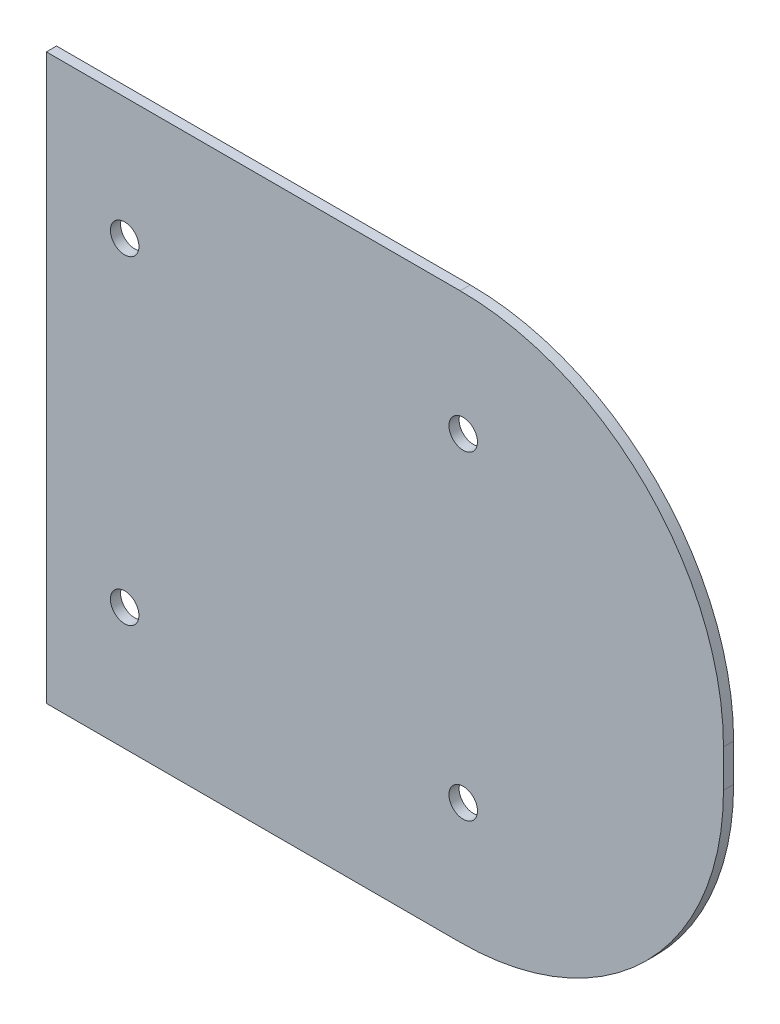
ISO-10303-21;
HEADER;
FILE_DESCRIPTION(('STEP AP214'),'2;1');
FILE_NAME('part.step','',(''),(''),'','','');
FILE_SCHEMA(('AUTOMOTIVE_DESIGN { 1 0 10303 214 1 1 1 1 }'));
ENDSEC;
DATA;
#1=APPLICATION_CONTEXT('core data for automotive mechanical design processes');
#2=APPLICATION_PROTOCOL_DEFINITION('international standard','automotive_design',2000,#1);
#3=PRODUCT_CONTEXT('',#1,'mechanical');
#4=PRODUCT('Part','Part','',(#3));
#5=PRODUCT_RELATED_PRODUCT_CATEGORY('part','',(#4));
#6=PRODUCT_DEFINITION_FORMATION('','',#4);
#7=PRODUCT_DEFINITION_CONTEXT('part definition',#1,'design');
#8=PRODUCT_DEFINITION('design','',#6,#7);
#9=PRODUCT_DEFINITION_SHAPE('','',#8);
#10=(LENGTH_UNIT() NAMED_UNIT(*) SI_UNIT(.MILLI.,.METRE.));
#11=(NAMED_UNIT(*) PLANE_ANGLE_UNIT() SI_UNIT($,.RADIAN.));
#12=(NAMED_UNIT(*) SI_UNIT($,.STERADIAN.) SOLID_ANGLE_UNIT());
#13=UNCERTAINTY_MEASURE_WITH_UNIT(LENGTH_MEASURE(1.E-05),#10,'distance_accuracy_value','');
#14=(GEOMETRIC_REPRESENTATION_CONTEXT(3) GLOBAL_UNCERTAINTY_ASSIGNED_CONTEXT((#13)) GLOBAL_UNIT_ASSIGNED_CONTEXT((#10,
#11,#12)) REPRESENTATION_CONTEXT('',''));
#15=CARTESIAN_POINT('',(0.,0.,0.));
#16=DIRECTION('',(0.,0.,1.));
#17=DIRECTION('',(1.,0.,0.));
#18=AXIS2_PLACEMENT_3D('',#15,#16,#17);
#19=CARTESIAN_POINT('',(-90.,-75.,2.7));
#20=DIRECTION('',(1.,0.,0.));
#21=DIRECTION('',(0.,0.,-1.));
#22=AXIS2_PLACEMENT_3D('',#19,#20,#21);
#23=PLANE('',#22);
#24=DIRECTION('',(0.,-1.,0.));
#25=VECTOR('',#24,1.);
#26=CARTESIAN_POINT('',(-90.,-75.,0.));
#27=LINE('',#26,#25);
#28=CARTESIAN_POINT('',(-90.,75.,0.));
#29=VERTEX_POINT('',#28);
#30=CARTESIAN_POINT('',(-90.,-75.,0.));
#31=VERTEX_POINT('',#30);
#32=EDGE_CURVE('E119',#29,#31,#27,.T.);
#33=ORIENTED_EDGE('',*,*,#32,.T.);
#34=DIRECTION('',(0.,0.,-1.));
#35=VECTOR('',#34,1.);
#36=CARTESIAN_POINT('',(-90.,-75.,2.7));
#37=LINE('',#36,#35);
#38=CARTESIAN_POINT('',(-90.,-75.,2.7));
#39=VERTEX_POINT('',#38);
#40=EDGE_CURVE('E11',#39,#31,#37,.T.);
#41=ORIENTED_EDGE('',*,*,#40,.F.);
#42=DIRECTION('',(0.,-1.,0.));
#43=VECTOR('',#42,1.);
#44=CARTESIAN_POINT('',(-90.,-75.,2.7));
#45=LINE('',#44,#43);
#46=CARTESIAN_POINT('',(-90.,75.,2.7));
#47=VERTEX_POINT('',#46);
#48=EDGE_CURVE('E130',#47,#39,#45,.T.);
#49=ORIENTED_EDGE('',*,*,#48,.F.);
#50=DIRECTION('',(0.,0.,-1.));
#51=VECTOR('',#50,1.);
#52=CARTESIAN_POINT('',(-90.,75.,2.7));
#53=LINE('',#52,#51);
#54=EDGE_CURVE('E115',#47,#29,#53,.T.);
#55=ORIENTED_EDGE('',*,*,#54,.T.);
#56=EDGE_LOOP('',(#33,#41,#49,#55));
#57=FACE_BOUND('',#56,.T.);
#58=ADVANCED_FACE('F33',(#57),#23,.F.);
#59=CARTESIAN_POINT('',(-90.,-75.,2.7));
#60=DIRECTION('',(0.,1.,0.));
#61=DIRECTION('',(0.,0.,1.));
#62=AXIS2_PLACEMENT_3D('',#59,#60,#61);
#63=PLANE('',#62);
#64=DIRECTION('',(1.,0.,0.));
#65=VECTOR('',#64,1.);
#66=CARTESIAN_POINT('',(-90.,-75.,0.));
#67=LINE('',#66,#65);
#68=CARTESIAN_POINT('',(19.9999999999995,-75.,0.));
#69=VERTEX_POINT('',#68);
#70=EDGE_CURVE('E122',#31,#69,#67,.T.);
#71=ORIENTED_EDGE('',*,*,#70,.T.);
#72=DIRECTION('',(0.,0.,-1.));
#73=VECTOR('',#72,1.);
#74=CARTESIAN_POINT('',(19.9999999999995,-75.,2.7));
#75=LINE('',#74,#73);
#76=CARTESIAN_POINT('',(19.9999999999995,-75.,2.7));
#77=VERTEX_POINT('',#76);
#78=EDGE_CURVE('E42',#77,#69,#75,.T.);
#79=ORIENTED_EDGE('',*,*,#78,.F.);
#80=DIRECTION('',(1.,0.,0.));
#81=VECTOR('',#80,1.);
#82=CARTESIAN_POINT('',(-90.,-75.,2.7));
#83=LINE('',#82,#81);
#84=EDGE_CURVE('E88',#39,#77,#83,.T.);
#85=ORIENTED_EDGE('',*,*,#84,.F.);
#86=ORIENTED_EDGE('',*,*,#40,.T.);
#87=EDGE_LOOP('',(#71,#79,#85,#86));
#88=FACE_BOUND('',#87,.T.);
#89=ADVANCED_FACE('F162',(#88),#63,.F.);
#90=CARTESIAN_POINT('',(20.,-4.99999999999998,2.7));
#91=DIRECTION('',(0.,0.,-1.));
#92=DIRECTION('',(-1.,0.,0.));
#93=AXIS2_PLACEMENT_3D('',#90,#91,#92);
#94=CYLINDRICAL_SURFACE('',#93,70.);
#95=CARTESIAN_POINT('',(20.,-4.99999999999998,0.));
#96=DIRECTION('',(0.,0.,1.));
#97=DIRECTION('',(1.,0.,0.));
#98=AXIS2_PLACEMENT_3D('',#95,#96,#97);
#99=CIRCLE('',#98,70.);
#100=CARTESIAN_POINT('',(90.,-4.99999999999948,0.));
#101=VERTEX_POINT('',#100);
#102=EDGE_CURVE('E125',#69,#101,#99,.T.);
#103=ORIENTED_EDGE('',*,*,#102,.T.);
#104=DIRECTION('',(0.,0.,-1.));
#105=VECTOR('',#104,1.);
#106=CARTESIAN_POINT('',(90.,-4.99999999999948,2.7));
#107=LINE('',#106,#105);
#108=CARTESIAN_POINT('',(90.,-4.99999999999948,2.7));
#109=VERTEX_POINT('',#108);
#110=EDGE_CURVE('E110',#109,#101,#107,.T.);
#111=ORIENTED_EDGE('',*,*,#110,.F.);
#112=CARTESIAN_POINT('',(20.,-4.99999999999998,2.7));
#113=DIRECTION('',(0.,0.,1.));
#114=DIRECTION('',(1.,0.,0.));
#115=AXIS2_PLACEMENT_3D('',#112,#113,#114);
#116=CIRCLE('',#115,70.);
#117=EDGE_CURVE('E101',#77,#109,#116,.T.);
#118=ORIENTED_EDGE('',*,*,#117,.F.);
#119=ORIENTED_EDGE('',*,*,#78,.T.);
#120=EDGE_LOOP('',(#103,#111,#118,#119));
#121=FACE_BOUND('',#120,.T.);
#122=ADVANCED_FACE('F165',(#121),#94,.T.);
#123=CARTESIAN_POINT('',(90.,-4.99999999999949,2.7));
#124=DIRECTION('',(-1.,0.,0.));
#125=DIRECTION('',(0.,-1.,0.));
#126=AXIS2_PLACEMENT_3D('',#123,#124,#125);
#127=PLANE('',#126);
#128=DIRECTION('',(0.,1.,0.));
#129=VECTOR('',#128,1.);
#130=CARTESIAN_POINT('',(90.,-4.99999999999949,0.));
#131=LINE('',#130,#129);
#132=CARTESIAN_POINT('',(90.,4.99999999999999,0.));
#133=VERTEX_POINT('',#132);
#134=EDGE_CURVE('E109',#101,#133,#131,.T.);
#135=ORIENTED_EDGE('',*,*,#134,.T.);
#136=DIRECTION('',(0.,0.,-1.));
#137=VECTOR('',#136,1.);
#138=CARTESIAN_POINT('',(90.,4.99999999999999,2.7));
#139=LINE('',#138,#137);
#140=CARTESIAN_POINT('',(90.,4.99999999999999,2.7));
#141=VERTEX_POINT('',#140);
#142=EDGE_CURVE('E106',#141,#133,#139,.T.);
#143=ORIENTED_EDGE('',*,*,#142,.F.);
#144=DIRECTION('',(0.,1.,0.));
#145=VECTOR('',#144,1.);
#146=CARTESIAN_POINT('',(90.,-4.99999999999949,2.7));
#147=LINE('',#146,#145);
#148=EDGE_CURVE('E95',#109,#141,#147,.T.);
#149=ORIENTED_EDGE('',*,*,#148,.F.);
#150=ORIENTED_EDGE('',*,*,#110,.T.);
#151=EDGE_LOOP('',(#135,#143,#149,#150));
#152=FACE_BOUND('',#151,.T.);
#153=ADVANCED_FACE('F107',(#152),#127,.F.);
#154=CARTESIAN_POINT('',(20.,4.99999999999999,2.7));
#155=DIRECTION('',(0.,0.,-1.));
#156=DIRECTION('',(-1.,0.,0.));
#157=AXIS2_PLACEMENT_3D('',#154,#155,#156);
#158=CYLINDRICAL_SURFACE('',#157,70.);
#159=CARTESIAN_POINT('',(20.,4.99999999999999,0.));
#160=DIRECTION('',(0.,0.,1.));
#161=DIRECTION('',(-1.,0.,0.));
#162=AXIS2_PLACEMENT_3D('',#159,#160,#161);
#163=CIRCLE('',#162,70.);
#164=CARTESIAN_POINT('',(20.,75.,0.));
#165=VERTEX_POINT('',#164);
#166=EDGE_CURVE('E74',#133,#165,#163,.T.);
#167=ORIENTED_EDGE('',*,*,#166,.T.);
#168=DIRECTION('',(0.,0.,-1.));
#169=VECTOR('',#168,1.);
#170=CARTESIAN_POINT('',(20.,75.,2.7));
#171=LINE('',#170,#169);
#172=CARTESIAN_POINT('',(20.,75.,2.7));
#173=VERTEX_POINT('',#172);
#174=EDGE_CURVE('E111',#173,#165,#171,.T.);
#175=ORIENTED_EDGE('',*,*,#174,.F.);
#176=CARTESIAN_POINT('',(20.,4.99999999999999,2.7));
#177=DIRECTION('',(0.,0.,1.));
#178=DIRECTION('',(-1.,0.,0.));
#179=AXIS2_PLACEMENT_3D('',#176,#177,#178);
#180=CIRCLE('',#179,70.);
#181=EDGE_CURVE('E99',#141,#173,#180,.T.);
#182=ORIENTED_EDGE('',*,*,#181,.F.);
#183=ORIENTED_EDGE('',*,*,#142,.T.);
#184=EDGE_LOOP('',(#167,#175,#182,#183));
#185=FACE_BOUND('',#184,.T.);
#186=ADVANCED_FACE('F113',(#185),#158,.T.);
#187=CARTESIAN_POINT('',(-90.,75.,2.7));
#188=DIRECTION('',(0.,-1.,0.));
#189=DIRECTION('',(0.,0.,-1.));
#190=AXIS2_PLACEMENT_3D('',#187,#188,#189);
#191=PLANE('',#190);
#192=DIRECTION('',(-1.,0.,0.));
#193=VECTOR('',#192,1.);
#194=CARTESIAN_POINT('',(-90.,75.,0.));
#195=LINE('',#194,#193);
#196=EDGE_CURVE('E80',#165,#29,#195,.T.);
#197=ORIENTED_EDGE('',*,*,#196,.T.);
#198=ORIENTED_EDGE('',*,*,#54,.F.);
#199=DIRECTION('',(-1.,0.,0.));
#200=VECTOR('',#199,1.);
#201=CARTESIAN_POINT('',(-90.,75.,2.7));
#202=LINE('',#201,#200);
#203=EDGE_CURVE('E51',#173,#47,#202,.T.);
#204=ORIENTED_EDGE('',*,*,#203,.F.);
#205=ORIENTED_EDGE('',*,*,#174,.T.);
#206=EDGE_LOOP('',(#197,#198,#204,#205));
#207=FACE_BOUND('',#206,.T.);
#208=ADVANCED_FACE('F170',(#207),#191,.F.);
#209=CARTESIAN_POINT('',(20.,4.99999999999999,2.7));
#210=DIRECTION('',(0.,0.,-1.));
#211=DIRECTION('',(-1.,0.,0.));
#212=AXIS2_PLACEMENT_3D('',#209,#210,#211);
#213=PLANE('',#212);
#214=CARTESIAN_POINT('',(-69.1871914812023,-42.4685606246405,2.7));
#215=DIRECTION('',(0.,0.,1.));
#216=DIRECTION('',(-1.,0.,0.));
#217=AXIS2_PLACEMENT_3D('',#214,#215,#216);
#218=CIRCLE('',#217,3.79000000000001);
#219=CARTESIAN_POINT('',(-72.9771914812023,-42.4685606246405,2.7));
#220=VERTEX_POINT('',#219);
#221=EDGE_CURVE('E154',#220,#220,#218,.T.);
#222=ORIENTED_EDGE('',*,*,#221,.F.);
#223=EDGE_LOOP('',(#222));
#224=FACE_BOUND('',#223,.T.);
#225=CARTESIAN_POINT('',(20.8128085187977,-42.4685606246405,2.7));
#226=DIRECTION('',(0.,0.,1.));
#227=DIRECTION('',(-1.,0.,0.));
#228=AXIS2_PLACEMENT_3D('',#225,#226,#227);
#229=CIRCLE('',#228,3.79);
#230=CARTESIAN_POINT('',(17.0228085187977,-42.4685606246405,2.7));
#231=VERTEX_POINT('',#230);
#232=EDGE_CURVE('E144',#231,#231,#229,.T.);
#233=ORIENTED_EDGE('',*,*,#232,.F.);
#234=EDGE_LOOP('',(#233));
#235=FACE_BOUND('',#234,.T.);
#236=CARTESIAN_POINT('',(20.8128085187977,42.4685606246405,2.7));
#237=DIRECTION('',(0.,0.,1.));
#238=DIRECTION('',(1.,0.,0.));
#239=AXIS2_PLACEMENT_3D('',#236,#237,#238);
#240=CIRCLE('',#239,3.79);
#241=CARTESIAN_POINT('',(24.6028085187977,42.4685606246405,2.7));
#242=VERTEX_POINT('',#241);
#243=EDGE_CURVE('E141',#242,#242,#240,.T.);
#244=ORIENTED_EDGE('',*,*,#243,.F.);
#245=EDGE_LOOP('',(#244));
#246=FACE_BOUND('',#245,.T.);
#247=CARTESIAN_POINT('',(-69.1871914812023,42.4685606246405,2.7));
#248=DIRECTION('',(0.,0.,1.));
#249=DIRECTION('',(1.,0.,0.));
#250=AXIS2_PLACEMENT_3D('',#247,#248,#249);
#251=CIRCLE('',#250,3.79000000000001);
#252=CARTESIAN_POINT('',(-65.3971914812023,42.4685606246405,2.7));
#253=VERTEX_POINT('',#252);
#254=EDGE_CURVE('E138',#253,#253,#251,.T.);
#255=ORIENTED_EDGE('',*,*,#254,.F.);
#256=EDGE_LOOP('',(#255));
#257=FACE_BOUND('',#256,.T.);
#258=ORIENTED_EDGE('',*,*,#48,.T.);
#259=ORIENTED_EDGE('',*,*,#84,.T.);
#260=ORIENTED_EDGE('',*,*,#117,.T.);
#261=ORIENTED_EDGE('',*,*,#148,.T.);
#262=ORIENTED_EDGE('',*,*,#181,.T.);
#263=ORIENTED_EDGE('',*,*,#203,.T.);
#264=EDGE_LOOP('',(#258,#259,#260,#261,#262,#263));
#265=FACE_BOUND('',#264,.T.);
#266=ADVANCED_FACE('F97',(#224,#235,#246,#257,#265),#213,.F.);
#267=CARTESIAN_POINT('',(20.,4.99999999999999,0.));
#268=DIRECTION('',(0.,0.,-1.));
#269=DIRECTION('',(-1.,0.,0.));
#270=AXIS2_PLACEMENT_3D('',#267,#268,#269);
#271=PLANE('',#270);
#272=CARTESIAN_POINT('',(-69.1871914812023,-42.4685606246405,0.));
#273=DIRECTION('',(0.,0.,-1.));
#274=DIRECTION('',(-1.,0.,0.));
#275=AXIS2_PLACEMENT_3D('',#272,#273,#274);
#276=CIRCLE('',#275,3.79000000000001);
#277=CARTESIAN_POINT('',(-72.9771914812023,-42.4685606246405,0.));
#278=VERTEX_POINT('',#277);
#279=EDGE_CURVE('E36',#278,#278,#276,.T.);
#280=ORIENTED_EDGE('',*,*,#279,.F.);
#281=EDGE_LOOP('',(#280));
#282=FACE_BOUND('',#281,.T.);
#283=CARTESIAN_POINT('',(20.8128085187977,-42.4685606246405,0.));
#284=DIRECTION('',(0.,0.,-1.));
#285=DIRECTION('',(-1.,0.,0.));
#286=AXIS2_PLACEMENT_3D('',#283,#284,#285);
#287=CIRCLE('',#286,3.79);
#288=CARTESIAN_POINT('',(17.0228085187977,-42.4685606246405,0.));
#289=VERTEX_POINT('',#288);
#290=EDGE_CURVE('E142',#289,#289,#287,.T.);
#291=ORIENTED_EDGE('',*,*,#290,.F.);
#292=EDGE_LOOP('',(#291));
#293=FACE_BOUND('',#292,.T.);
#294=CARTESIAN_POINT('',(20.8128085187977,42.4685606246405,0.));
#295=DIRECTION('',(0.,0.,-1.));
#296=DIRECTION('',(-1.,0.,0.));
#297=AXIS2_PLACEMENT_3D('',#294,#295,#296);
#298=CIRCLE('',#297,3.79);
#299=CARTESIAN_POINT('',(17.0228085187977,42.4685606246405,0.));
#300=VERTEX_POINT('',#299);
#301=EDGE_CURVE('E139',#300,#300,#298,.T.);
#302=ORIENTED_EDGE('',*,*,#301,.F.);
#303=EDGE_LOOP('',(#302));
#304=FACE_BOUND('',#303,.T.);
#305=CARTESIAN_POINT('',(-69.1871914812023,42.4685606246405,0.));
#306=DIRECTION('',(0.,0.,-1.));
#307=DIRECTION('',(-1.,0.,0.));
#308=AXIS2_PLACEMENT_3D('',#305,#306,#307);
#309=CIRCLE('',#308,3.79000000000001);
#310=CARTESIAN_POINT('',(-72.9771914812023,42.4685606246405,0.));
#311=VERTEX_POINT('',#310);
#312=EDGE_CURVE('E123',#311,#311,#309,.T.);
#313=ORIENTED_EDGE('',*,*,#312,.F.);
#314=EDGE_LOOP('',(#313));
#315=FACE_BOUND('',#314,.T.);
#316=ORIENTED_EDGE('',*,*,#32,.F.);
#317=ORIENTED_EDGE('',*,*,#196,.F.);
#318=ORIENTED_EDGE('',*,*,#166,.F.);
#319=ORIENTED_EDGE('',*,*,#134,.F.);
#320=ORIENTED_EDGE('',*,*,#102,.F.);
#321=ORIENTED_EDGE('',*,*,#70,.F.);
#322=EDGE_LOOP('',(#316,#317,#318,#319,#320,#321));
#323=FACE_BOUND('',#322,.T.);
#324=ADVANCED_FACE('F168',(#282,#293,#304,#315,#323),#271,.T.);
#325=CARTESIAN_POINT('',(-69.1871914812023,42.4685606246405,-0.0499999999999997));
#326=DIRECTION('',(0.,0.,1.));
#327=DIRECTION('',(1.,0.,0.));
#328=AXIS2_PLACEMENT_3D('',#325,#326,#327);
#329=CYLINDRICAL_SURFACE('',#328,3.79000000000001);
#330=ORIENTED_EDGE('',*,*,#312,.T.);
#331=EDGE_LOOP('',(#330));
#332=FACE_BOUND('',#331,.T.);
#333=ORIENTED_EDGE('',*,*,#254,.T.);
#334=EDGE_LOOP('',(#333));
#335=FACE_BOUND('',#334,.T.);
#336=ADVANCED_FACE('F218',(#332,#335),#329,.F.);
#337=CARTESIAN_POINT('',(20.8128085187977,42.4685606246405,-0.0499999999999997));
#338=DIRECTION('',(0.,0.,1.));
#339=DIRECTION('',(1.,0.,0.));
#340=AXIS2_PLACEMENT_3D('',#337,#338,#339);
#341=CYLINDRICAL_SURFACE('',#340,3.79);
#342=ORIENTED_EDGE('',*,*,#301,.T.);
#343=EDGE_LOOP('',(#342));
#344=FACE_BOUND('',#343,.T.);
#345=ORIENTED_EDGE('',*,*,#243,.T.);
#346=EDGE_LOOP('',(#345));
#347=FACE_BOUND('',#346,.T.);
#348=ADVANCED_FACE('F227',(#344,#347),#341,.F.);
#349=CARTESIAN_POINT('',(20.8128085187977,-42.4685606246405,-0.0499999999999997));
#350=DIRECTION('',(0.,0.,1.));
#351=DIRECTION('',(1.,0.,0.));
#352=AXIS2_PLACEMENT_3D('',#349,#350,#351);
#353=CYLINDRICAL_SURFACE('',#352,3.79);
#354=ORIENTED_EDGE('',*,*,#290,.T.);
#355=EDGE_LOOP('',(#354));
#356=FACE_BOUND('',#355,.T.);
#357=ORIENTED_EDGE('',*,*,#232,.T.);
#358=EDGE_LOOP('',(#357));
#359=FACE_BOUND('',#358,.T.);
#360=ADVANCED_FACE('F237',(#356,#359),#353,.F.);
#361=CARTESIAN_POINT('',(-69.1871914812023,-42.4685606246405,-0.0499999999999997));
#362=DIRECTION('',(0.,0.,1.));
#363=DIRECTION('',(1.,0.,0.));
#364=AXIS2_PLACEMENT_3D('',#361,#362,#363);
#365=CYLINDRICAL_SURFACE('',#364,3.79000000000001);
#366=ORIENTED_EDGE('',*,*,#279,.T.);
#367=EDGE_LOOP('',(#366));
#368=FACE_BOUND('',#367,.T.);
#369=ORIENTED_EDGE('',*,*,#221,.T.);
#370=EDGE_LOOP('',(#369));
#371=FACE_BOUND('',#370,.T.);
#372=ADVANCED_FACE('F247',(#368,#371),#365,.F.);
#373=CLOSED_SHELL('',(#58,#89,#122,#153,#186,#208,#266,#324,#336,#348,#360,#372));
#374=MANIFOLD_SOLID_BREP('B2',#373);
#375=ADVANCED_BREP_SHAPE_REPRESENTATION('',(#18,#374),#14);
#376=SHAPE_DEFINITION_REPRESENTATION(#9,#375);
ENDSEC;
END-ISO-10303-21;
